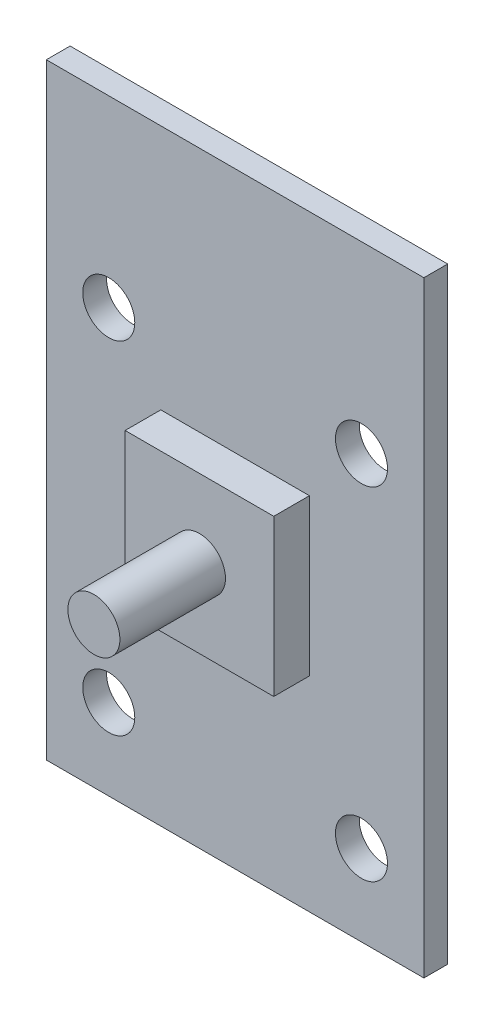
ISO-10303-21;
HEADER;
FILE_DESCRIPTION(('STEP AP214'),'2;1');
FILE_NAME('part.step','',(''),(''),'','','');
FILE_SCHEMA(('AUTOMOTIVE_DESIGN { 1 0 10303 214 1 1 1 1 }'));
ENDSEC;
DATA;
#1=APPLICATION_CONTEXT('core data for automotive mechanical design processes');
#2=APPLICATION_PROTOCOL_DEFINITION('international standard','automotive_design',2000,#1);
#3=PRODUCT_CONTEXT('',#1,'mechanical');
#4=PRODUCT('Part','Part','',(#3));
#5=PRODUCT_RELATED_PRODUCT_CATEGORY('part','',(#4));
#6=PRODUCT_DEFINITION_FORMATION('','',#4);
#7=PRODUCT_DEFINITION_CONTEXT('part definition',#1,'design');
#8=PRODUCT_DEFINITION('design','',#6,#7);
#9=PRODUCT_DEFINITION_SHAPE('','',#8);
#10=(LENGTH_UNIT() NAMED_UNIT(*) SI_UNIT(.MILLI.,.METRE.));
#11=(NAMED_UNIT(*) PLANE_ANGLE_UNIT() SI_UNIT($,.RADIAN.));
#12=(NAMED_UNIT(*) SI_UNIT($,.STERADIAN.) SOLID_ANGLE_UNIT());
#13=UNCERTAINTY_MEASURE_WITH_UNIT(LENGTH_MEASURE(1.E-05),#10,'distance_accuracy_value','');
#14=(GEOMETRIC_REPRESENTATION_CONTEXT(3) GLOBAL_UNCERTAINTY_ASSIGNED_CONTEXT((#13)) GLOBAL_UNIT_ASSIGNED_CONTEXT((#10,
#11,#12)) REPRESENTATION_CONTEXT('',''));
#15=CARTESIAN_POINT('',(0.,0.,0.));
#16=DIRECTION('',(0.,0.,1.));
#17=DIRECTION('',(1.,0.,0.));
#18=AXIS2_PLACEMENT_3D('',#15,#16,#17);
#19=CARTESIAN_POINT('',(0.,0.,1.6));
#20=DIRECTION('',(0.,0.,1.));
#21=DIRECTION('',(1.,0.,0.));
#22=AXIS2_PLACEMENT_3D('',#19,#20,#21);
#23=PLANE('',#22);
#24=CARTESIAN_POINT('',(62.7554487418666,48.4792212091622,1.6));
#25=DIRECTION('',(0.,0.,1.));
#26=DIRECTION('',(1.,0.,0.));
#27=AXIS2_PLACEMENT_3D('',#24,#25,#26);
#28=CIRCLE('',#27,1.75);
#29=CARTESIAN_POINT('',(64.5054487418666,48.4792212091622,1.6));
#30=VERTEX_POINT('',#29);
#31=EDGE_CURVE('E151',#30,#30,#28,.T.);
#32=ORIENTED_EDGE('',*,*,#31,.F.);
#33=EDGE_LOOP('',(#32));
#34=FACE_BOUND('',#33,.T.);
#35=CARTESIAN_POINT('',(62.7554487418666,25.4792212091622,1.6));
#36=DIRECTION('',(0.,0.,1.));
#37=DIRECTION('',(1.,0.,0.));
#38=AXIS2_PLACEMENT_3D('',#35,#36,#37);
#39=CIRCLE('',#38,1.75);
#40=CARTESIAN_POINT('',(64.5054487418666,25.4792212091622,1.6));
#41=VERTEX_POINT('',#40);
#42=EDGE_CURVE('E163',#41,#41,#39,.T.);
#43=ORIENTED_EDGE('',*,*,#42,.F.);
#44=EDGE_LOOP('',(#43));
#45=FACE_BOUND('',#44,.T.);
#46=DIRECTION('',(0.,-1.,0.));
#47=VECTOR('',#46,1.);
#48=CARTESIAN_POINT('',(41.5554487418665,60.8247313490495,1.6));
#49=LINE('',#48,#47);
#50=CARTESIAN_POINT('',(41.5554487418665,60.8247313490495,1.6));
#51=VERTEX_POINT('',#50);
#52=CARTESIAN_POINT('',(41.5554487418665,20.0247313490495,1.6));
#53=VERTEX_POINT('',#52);
#54=EDGE_CURVE('E169',#51,#53,#49,.T.);
#55=ORIENTED_EDGE('',*,*,#54,.T.);
#56=DIRECTION('',(1.,0.,0.));
#57=VECTOR('',#56,1.);
#58=CARTESIAN_POINT('',(41.5554487418665,20.0247313490495,1.6));
#59=LINE('',#58,#57);
#60=CARTESIAN_POINT('',(66.9554487418665,20.0247313490495,1.6));
#61=VERTEX_POINT('',#60);
#62=EDGE_CURVE('E87',#53,#61,#59,.T.);
#63=ORIENTED_EDGE('',*,*,#62,.T.);
#64=DIRECTION('',(0.,1.,0.));
#65=VECTOR('',#64,1.);
#66=CARTESIAN_POINT('',(66.9554487418665,60.8247313490495,1.6));
#67=LINE('',#66,#65);
#68=CARTESIAN_POINT('',(66.9554487418665,60.8247313490495,1.6));
#69=VERTEX_POINT('',#68);
#70=EDGE_CURVE('E172',#61,#69,#67,.T.);
#71=ORIENTED_EDGE('',*,*,#70,.T.);
#72=DIRECTION('',(-1.,0.,0.));
#73=VECTOR('',#72,1.);
#74=CARTESIAN_POINT('',(41.5554487418665,60.8247313490495,1.6));
#75=LINE('',#74,#73);
#76=EDGE_CURVE('E58',#69,#51,#75,.T.);
#77=ORIENTED_EDGE('',*,*,#76,.T.);
#78=EDGE_LOOP('',(#55,#63,#71,#77));
#79=FACE_BOUND('',#78,.T.);
#80=CARTESIAN_POINT('',(45.7554487418666,25.4792212091622,1.6));
#81=DIRECTION('',(0.,0.,1.));
#82=DIRECTION('',(1.,0.,0.));
#83=AXIS2_PLACEMENT_3D('',#80,#81,#82);
#84=CIRCLE('',#83,1.75);
#85=CARTESIAN_POINT('',(47.5054487418666,25.4792212091622,1.6));
#86=VERTEX_POINT('',#85);
#87=EDGE_CURVE('E157',#86,#86,#84,.T.);
#88=ORIENTED_EDGE('',*,*,#87,.F.);
#89=EDGE_LOOP('',(#88));
#90=FACE_BOUND('',#89,.T.);
#91=CARTESIAN_POINT('',(45.7554487418666,48.4792212091622,1.6));
#92=DIRECTION('',(0.,0.,1.));
#93=DIRECTION('',(1.,0.,0.));
#94=AXIS2_PLACEMENT_3D('',#91,#92,#93);
#95=CIRCLE('',#94,1.75);
#96=CARTESIAN_POINT('',(47.5054487418666,48.4792212091622,1.6));
#97=VERTEX_POINT('',#96);
#98=EDGE_CURVE('E145',#97,#97,#95,.T.);
#99=ORIENTED_EDGE('',*,*,#98,.F.);
#100=EDGE_LOOP('',(#99));
#101=FACE_BOUND('',#100,.T.);
#102=DIRECTION('',(-1.,0.,0.));
#103=VECTOR('',#102,1.);
#104=CARTESIAN_POINT('',(49.2554487418665,44.2747313490495,1.6));
#105=LINE('',#104,#103);
#106=CARTESIAN_POINT('',(59.2554487418665,44.2747313490495,1.6));
#107=VERTEX_POINT('',#106);
#108=CARTESIAN_POINT('',(49.2554487418665,44.2747313490495,1.6));
#109=VERTEX_POINT('',#108);
#110=EDGE_CURVE('E210',#107,#109,#105,.T.);
#111=ORIENTED_EDGE('',*,*,#110,.F.);
#112=DIRECTION('',(0.,1.,0.));
#113=VECTOR('',#112,1.);
#114=CARTESIAN_POINT('',(59.2554487418665,44.2747313490495,1.6));
#115=LINE('',#114,#113);
#116=CARTESIAN_POINT('',(59.2554487418665,33.7747313490495,1.6));
#117=VERTEX_POINT('',#116);
#118=EDGE_CURVE('E132',#117,#107,#115,.T.);
#119=ORIENTED_EDGE('',*,*,#118,.F.);
#120=DIRECTION('',(1.,0.,0.));
#121=VECTOR('',#120,1.);
#122=CARTESIAN_POINT('',(49.2554487418665,33.7747313490495,1.6));
#123=LINE('',#122,#121);
#124=CARTESIAN_POINT('',(49.2554487418665,33.7747313490495,1.6));
#125=VERTEX_POINT('',#124);
#126=EDGE_CURVE('E128',#125,#117,#123,.T.);
#127=ORIENTED_EDGE('',*,*,#126,.F.);
#128=DIRECTION('',(0.,-1.,0.));
#129=VECTOR('',#128,1.);
#130=CARTESIAN_POINT('',(49.2554487418665,44.2747313490495,1.6));
#131=LINE('',#130,#129);
#132=EDGE_CURVE('E212',#109,#125,#131,.T.);
#133=ORIENTED_EDGE('',*,*,#132,.F.);
#134=EDGE_LOOP('',(#111,#119,#127,#133));
#135=FACE_BOUND('',#134,.T.);
#136=ADVANCED_FACE('F33',(#34,#45,#79,#90,#101,#135),#23,.T.);
#137=CARTESIAN_POINT('',(0.,0.,0.));
#138=DIRECTION('',(0.,0.,1.));
#139=DIRECTION('',(1.,0.,0.));
#140=AXIS2_PLACEMENT_3D('',#137,#138,#139);
#141=PLANE('',#140);
#142=DIRECTION('',(0.,-1.,0.));
#143=VECTOR('',#142,1.);
#144=CARTESIAN_POINT('',(41.5554487418665,60.8247313490495,0.));
#145=LINE('',#144,#143);
#146=CARTESIAN_POINT('',(41.5554487418665,60.8247313490495,0.));
#147=VERTEX_POINT('',#146);
#148=CARTESIAN_POINT('',(41.5554487418665,20.0247313490495,0.));
#149=VERTEX_POINT('',#148);
#150=EDGE_CURVE('E166',#147,#149,#145,.T.);
#151=ORIENTED_EDGE('',*,*,#150,.F.);
#152=DIRECTION('',(-1.,0.,0.));
#153=VECTOR('',#152,1.);
#154=CARTESIAN_POINT('',(41.5554487418665,60.8247313490495,0.));
#155=LINE('',#154,#153);
#156=CARTESIAN_POINT('',(66.9554487418665,60.8247313490495,0.));
#157=VERTEX_POINT('',#156);
#158=EDGE_CURVE('E79',#157,#147,#155,.T.);
#159=ORIENTED_EDGE('',*,*,#158,.F.);
#160=DIRECTION('',(0.,1.,0.));
#161=VECTOR('',#160,1.);
#162=CARTESIAN_POINT('',(66.9554487418665,60.8247313490495,0.));
#163=LINE('',#162,#161);
#164=CARTESIAN_POINT('',(66.9554487418665,20.0247313490495,0.));
#165=VERTEX_POINT('',#164);
#166=EDGE_CURVE('E180',#165,#157,#163,.T.);
#167=ORIENTED_EDGE('',*,*,#166,.F.);
#168=DIRECTION('',(1.,0.,0.));
#169=VECTOR('',#168,1.);
#170=CARTESIAN_POINT('',(41.5554487418665,20.0247313490495,0.));
#171=LINE('',#170,#169);
#172=EDGE_CURVE('E178',#149,#165,#171,.T.);
#173=ORIENTED_EDGE('',*,*,#172,.F.);
#174=EDGE_LOOP('',(#151,#159,#167,#173));
#175=FACE_BOUND('',#174,.T.);
#176=CARTESIAN_POINT('',(62.7554487418666,25.4792212091622,0.));
#177=DIRECTION('',(0.,0.,1.));
#178=DIRECTION('',(1.,0.,0.));
#179=AXIS2_PLACEMENT_3D('',#176,#177,#178);
#180=CIRCLE('',#179,1.75);
#181=CARTESIAN_POINT('',(64.5054487418666,25.4792212091622,0.));
#182=VERTEX_POINT('',#181);
#183=EDGE_CURVE('E160',#182,#182,#180,.T.);
#184=ORIENTED_EDGE('',*,*,#183,.T.);
#185=EDGE_LOOP('',(#184));
#186=FACE_BOUND('',#185,.T.);
#187=CARTESIAN_POINT('',(45.7554487418666,25.4792212091622,0.));
#188=DIRECTION('',(0.,0.,1.));
#189=DIRECTION('',(1.,0.,0.));
#190=AXIS2_PLACEMENT_3D('',#187,#188,#189);
#191=CIRCLE('',#190,1.75);
#192=CARTESIAN_POINT('',(47.5054487418666,25.4792212091622,0.));
#193=VERTEX_POINT('',#192);
#194=EDGE_CURVE('E154',#193,#193,#191,.T.);
#195=ORIENTED_EDGE('',*,*,#194,.T.);
#196=EDGE_LOOP('',(#195));
#197=FACE_BOUND('',#196,.T.);
#198=CARTESIAN_POINT('',(62.7554487418666,48.4792212091622,0.));
#199=DIRECTION('',(0.,0.,1.));
#200=DIRECTION('',(1.,0.,0.));
#201=AXIS2_PLACEMENT_3D('',#198,#199,#200);
#202=CIRCLE('',#201,1.75);
#203=CARTESIAN_POINT('',(64.5054487418666,48.4792212091622,0.));
#204=VERTEX_POINT('',#203);
#205=EDGE_CURVE('E148',#204,#204,#202,.T.);
#206=ORIENTED_EDGE('',*,*,#205,.T.);
#207=EDGE_LOOP('',(#206));
#208=FACE_BOUND('',#207,.T.);
#209=CARTESIAN_POINT('',(45.7554487418666,48.4792212091622,0.));
#210=DIRECTION('',(0.,0.,1.));
#211=DIRECTION('',(1.,0.,0.));
#212=AXIS2_PLACEMENT_3D('',#209,#210,#211);
#213=CIRCLE('',#212,1.75);
#214=CARTESIAN_POINT('',(47.5054487418666,48.4792212091622,0.));
#215=VERTEX_POINT('',#214);
#216=EDGE_CURVE('E144',#215,#215,#213,.T.);
#217=ORIENTED_EDGE('',*,*,#216,.T.);
#218=EDGE_LOOP('',(#217));
#219=FACE_BOUND('',#218,.T.);
#220=CARTESIAN_POINT('',(54.2554487418665,39.0247313490494,0.));
#221=DIRECTION('',(0.,0.,1.));
#222=DIRECTION('',(1.,0.,0.));
#223=AXIS2_PLACEMENT_3D('',#220,#221,#222);
#224=CIRCLE('',#223,1.81610575474776);
#225=CARTESIAN_POINT('',(56.0715544966143,39.0247313490494,0.));
#226=VERTEX_POINT('',#225);
#227=EDGE_CURVE('E137',#226,#226,#224,.T.);
#228=ORIENTED_EDGE('',*,*,#227,.T.);
#229=EDGE_LOOP('',(#228));
#230=FACE_BOUND('',#229,.T.);
#231=ADVANCED_FACE('F196',(#175,#186,#197,#208,#219,#230),#141,.F.);
#232=CARTESIAN_POINT('',(41.5554487418665,60.8247313490495,1.6));
#233=DIRECTION('',(1.,0.,0.));
#234=DIRECTION('',(0.,1.,0.));
#235=AXIS2_PLACEMENT_3D('',#232,#233,#234);
#236=PLANE('',#235);
#237=ORIENTED_EDGE('',*,*,#150,.T.);
#238=DIRECTION('',(0.,0.,-1.));
#239=VECTOR('',#238,1.);
#240=CARTESIAN_POINT('',(41.5554487418665,20.0247313490495,1.6));
#241=LINE('',#240,#239);
#242=EDGE_CURVE('E37',#53,#149,#241,.T.);
#243=ORIENTED_EDGE('',*,*,#242,.F.);
#244=ORIENTED_EDGE('',*,*,#54,.F.);
#245=DIRECTION('',(0.,0.,-1.));
#246=VECTOR('',#245,1.);
#247=CARTESIAN_POINT('',(41.5554487418665,60.8247313490495,1.6));
#248=LINE('',#247,#246);
#249=EDGE_CURVE('E175',#51,#147,#248,.T.);
#250=ORIENTED_EDGE('',*,*,#249,.T.);
#251=EDGE_LOOP('',(#237,#243,#244,#250));
#252=FACE_BOUND('',#251,.T.);
#253=ADVANCED_FACE('F35',(#252),#236,.F.);
#254=CARTESIAN_POINT('',(41.5554487418665,20.0247313490495,1.6));
#255=DIRECTION('',(0.,1.,0.));
#256=DIRECTION('',(0.,0.,1.));
#257=AXIS2_PLACEMENT_3D('',#254,#255,#256);
#258=PLANE('',#257);
#259=ORIENTED_EDGE('',*,*,#172,.T.);
#260=DIRECTION('',(0.,0.,-1.));
#261=VECTOR('',#260,1.);
#262=CARTESIAN_POINT('',(66.9554487418665,20.0247313490495,1.6));
#263=LINE('',#262,#261);
#264=EDGE_CURVE('E185',#61,#165,#263,.T.);
#265=ORIENTED_EDGE('',*,*,#264,.F.);
#266=ORIENTED_EDGE('',*,*,#62,.F.);
#267=ORIENTED_EDGE('',*,*,#242,.T.);
#268=EDGE_LOOP('',(#259,#265,#266,#267));
#269=FACE_BOUND('',#268,.T.);
#270=ADVANCED_FACE('F191',(#269),#258,.F.);
#271=CARTESIAN_POINT('',(66.9554487418665,60.8247313490495,1.6));
#272=DIRECTION('',(-1.,0.,0.));
#273=DIRECTION('',(0.,-1.,0.));
#274=AXIS2_PLACEMENT_3D('',#271,#272,#273);
#275=PLANE('',#274);
#276=ORIENTED_EDGE('',*,*,#166,.T.);
#277=DIRECTION('',(0.,0.,-1.));
#278=VECTOR('',#277,1.);
#279=CARTESIAN_POINT('',(66.9554487418665,60.8247313490495,1.6));
#280=LINE('',#279,#278);
#281=EDGE_CURVE('E184',#69,#157,#280,.T.);
#282=ORIENTED_EDGE('',*,*,#281,.F.);
#283=ORIENTED_EDGE('',*,*,#70,.F.);
#284=ORIENTED_EDGE('',*,*,#264,.T.);
#285=EDGE_LOOP('',(#276,#282,#283,#284));
#286=FACE_BOUND('',#285,.T.);
#287=ADVANCED_FACE('F199',(#286),#275,.F.);
#288=CARTESIAN_POINT('',(41.5554487418665,60.8247313490495,1.6));
#289=DIRECTION('',(0.,-1.,0.));
#290=DIRECTION('',(0.,0.,-1.));
#291=AXIS2_PLACEMENT_3D('',#288,#289,#290);
#292=PLANE('',#291);
#293=ORIENTED_EDGE('',*,*,#158,.T.);
#294=ORIENTED_EDGE('',*,*,#249,.F.);
#295=ORIENTED_EDGE('',*,*,#76,.F.);
#296=ORIENTED_EDGE('',*,*,#281,.T.);
#297=EDGE_LOOP('',(#293,#294,#295,#296));
#298=FACE_BOUND('',#297,.T.);
#299=ADVANCED_FACE('F200',(#298),#292,.F.);
#300=CARTESIAN_POINT('',(62.7554487418666,25.4792212091622,1.6));
#301=DIRECTION('',(0.,0.,-1.));
#302=DIRECTION('',(-1.,0.,0.));
#303=AXIS2_PLACEMENT_3D('',#300,#301,#302);
#304=CYLINDRICAL_SURFACE('',#303,1.75);
#305=ORIENTED_EDGE('',*,*,#42,.T.);
#306=EDGE_LOOP('',(#305));
#307=FACE_BOUND('',#306,.T.);
#308=ORIENTED_EDGE('',*,*,#183,.F.);
#309=EDGE_LOOP('',(#308));
#310=FACE_BOUND('',#309,.T.);
#311=ADVANCED_FACE('F270',(#307,#310),#304,.F.);
#312=CARTESIAN_POINT('',(45.7554487418666,25.4792212091622,1.6));
#313=DIRECTION('',(0.,0.,-1.));
#314=DIRECTION('',(-1.,0.,0.));
#315=AXIS2_PLACEMENT_3D('',#312,#313,#314);
#316=CYLINDRICAL_SURFACE('',#315,1.75);
#317=ORIENTED_EDGE('',*,*,#87,.T.);
#318=EDGE_LOOP('',(#317));
#319=FACE_BOUND('',#318,.T.);
#320=ORIENTED_EDGE('',*,*,#194,.F.);
#321=EDGE_LOOP('',(#320));
#322=FACE_BOUND('',#321,.T.);
#323=ADVANCED_FACE('F266',(#319,#322),#316,.F.);
#324=CARTESIAN_POINT('',(62.7554487418666,48.4792212091622,1.6));
#325=DIRECTION('',(0.,0.,-1.));
#326=DIRECTION('',(-1.,0.,0.));
#327=AXIS2_PLACEMENT_3D('',#324,#325,#326);
#328=CYLINDRICAL_SURFACE('',#327,1.75);
#329=ORIENTED_EDGE('',*,*,#31,.T.);
#330=EDGE_LOOP('',(#329));
#331=FACE_BOUND('',#330,.T.);
#332=ORIENTED_EDGE('',*,*,#205,.F.);
#333=EDGE_LOOP('',(#332));
#334=FACE_BOUND('',#333,.T.);
#335=ADVANCED_FACE('F262',(#331,#334),#328,.F.);
#336=CARTESIAN_POINT('',(45.7554487418666,48.4792212091622,1.6));
#337=DIRECTION('',(0.,0.,-1.));
#338=DIRECTION('',(-1.,0.,0.));
#339=AXIS2_PLACEMENT_3D('',#336,#337,#338);
#340=CYLINDRICAL_SURFACE('',#339,1.75);
#341=ORIENTED_EDGE('',*,*,#98,.T.);
#342=EDGE_LOOP('',(#341));
#343=FACE_BOUND('',#342,.T.);
#344=ORIENTED_EDGE('',*,*,#216,.F.);
#345=EDGE_LOOP('',(#344));
#346=FACE_BOUND('',#345,.T.);
#347=ADVANCED_FACE('F258',(#343,#346),#340,.F.);
#348=CARTESIAN_POINT('',(54.2554487418665,39.0247313490494,1.6));
#349=DIRECTION('',(0.,0.,-1.));
#350=DIRECTION('',(-1.,0.,0.));
#351=AXIS2_PLACEMENT_3D('',#348,#349,#350);
#352=CYLINDRICAL_SURFACE('',#351,1.81610575474776);
#353=CARTESIAN_POINT('',(54.2554487418665,39.0247313490494,1.6));
#354=DIRECTION('',(0.,0.,1.));
#355=DIRECTION('',(1.,0.,0.));
#356=AXIS2_PLACEMENT_3D('',#353,#354,#355);
#357=CIRCLE('',#356,1.81610575474776);
#358=CARTESIAN_POINT('',(56.0715544966143,39.0247313490494,1.6));
#359=VERTEX_POINT('',#358);
#360=EDGE_CURVE('E134',#359,#359,#357,.T.);
#361=ORIENTED_EDGE('',*,*,#360,.T.);
#362=EDGE_LOOP('',(#361));
#363=FACE_BOUND('',#362,.T.);
#364=ORIENTED_EDGE('',*,*,#227,.F.);
#365=EDGE_LOOP('',(#364));
#366=FACE_BOUND('',#365,.T.);
#367=ADVANCED_FACE('F246',(#363,#366),#352,.F.);
#368=CARTESIAN_POINT('',(0.,0.,1.6));
#369=DIRECTION('',(0.,0.,1.));
#370=DIRECTION('',(1.,0.,0.));
#371=AXIS2_PLACEMENT_3D('',#368,#369,#370);
#372=PLANE('',#371);
#373=ORIENTED_EDGE('',*,*,#360,.F.);
#374=EDGE_LOOP('',(#373));
#375=FACE_BOUND('',#374,.T.);
#376=ADVANCED_FACE('F244',(#375),#372,.F.);
#377=CARTESIAN_POINT('',(59.2554487418665,44.2747313490495,4.));
#378=DIRECTION('',(-1.,0.,0.));
#379=DIRECTION('',(0.,0.,1.));
#380=AXIS2_PLACEMENT_3D('',#377,#378,#379);
#381=PLANE('',#380);
#382=ORIENTED_EDGE('',*,*,#118,.T.);
#383=DIRECTION('',(0.,0.,-1.));
#384=VECTOR('',#383,1.);
#385=CARTESIAN_POINT('',(59.2554487418665,44.2747313490495,4.));
#386=LINE('',#385,#384);
#387=CARTESIAN_POINT('',(59.2554487418665,44.2747313490495,4.));
#388=VERTEX_POINT('',#387);
#389=EDGE_CURVE('E113',#388,#107,#386,.T.);
#390=ORIENTED_EDGE('',*,*,#389,.F.);
#391=DIRECTION('',(0.,1.,0.));
#392=VECTOR('',#391,1.);
#393=CARTESIAN_POINT('',(59.2554487418665,44.2747313490495,4.));
#394=LINE('',#393,#392);
#395=CARTESIAN_POINT('',(59.2554487418665,33.7747313490495,4.));
#396=VERTEX_POINT('',#395);
#397=EDGE_CURVE('E120',#396,#388,#394,.T.);
#398=ORIENTED_EDGE('',*,*,#397,.F.);
#399=DIRECTION('',(0.,0.,-1.));
#400=VECTOR('',#399,1.);
#401=CARTESIAN_POINT('',(59.2554487418665,33.7747313490495,4.));
#402=LINE('',#401,#400);
#403=EDGE_CURVE('E220',#396,#117,#402,.T.);
#404=ORIENTED_EDGE('',*,*,#403,.T.);
#405=EDGE_LOOP('',(#382,#390,#398,#404));
#406=FACE_BOUND('',#405,.T.);
#407=ADVANCED_FACE('F130',(#406),#381,.F.);
#408=CARTESIAN_POINT('',(49.2554487418665,44.2747313490495,4.));
#409=DIRECTION('',(0.,-1.,0.));
#410=DIRECTION('',(0.,0.,-1.));
#411=AXIS2_PLACEMENT_3D('',#408,#409,#410);
#412=PLANE('',#411);
#413=ORIENTED_EDGE('',*,*,#110,.T.);
#414=DIRECTION('',(0.,0.,-1.));
#415=VECTOR('',#414,1.);
#416=CARTESIAN_POINT('',(49.2554487418665,44.2747313490495,4.));
#417=LINE('',#416,#415);
#418=CARTESIAN_POINT('',(49.2554487418665,44.2747313490495,4.));
#419=VERTEX_POINT('',#418);
#420=EDGE_CURVE('E116',#419,#109,#417,.T.);
#421=ORIENTED_EDGE('',*,*,#420,.F.);
#422=DIRECTION('',(-1.,0.,0.));
#423=VECTOR('',#422,1.);
#424=CARTESIAN_POINT('',(49.2554487418665,44.2747313490495,4.));
#425=LINE('',#424,#423);
#426=EDGE_CURVE('E109',#388,#419,#425,.T.);
#427=ORIENTED_EDGE('',*,*,#426,.F.);
#428=ORIENTED_EDGE('',*,*,#389,.T.);
#429=EDGE_LOOP('',(#413,#421,#427,#428));
#430=FACE_BOUND('',#429,.T.);
#431=ADVANCED_FACE('F111',(#430),#412,.F.);
#432=CARTESIAN_POINT('',(49.2554487418665,44.2747313490495,4.));
#433=DIRECTION('',(1.,0.,0.));
#434=DIRECTION('',(0.,0.,-1.));
#435=AXIS2_PLACEMENT_3D('',#432,#433,#434);
#436=PLANE('',#435);
#437=ORIENTED_EDGE('',*,*,#132,.T.);
#438=DIRECTION('',(0.,0.,-1.));
#439=VECTOR('',#438,1.);
#440=CARTESIAN_POINT('',(49.2554487418665,33.7747313490495,4.));
#441=LINE('',#440,#439);
#442=CARTESIAN_POINT('',(49.2554487418665,33.7747313490495,4.));
#443=VERTEX_POINT('',#442);
#444=EDGE_CURVE('E49',#443,#125,#441,.T.);
#445=ORIENTED_EDGE('',*,*,#444,.F.);
#446=DIRECTION('',(0.,-1.,0.));
#447=VECTOR('',#446,1.);
#448=CARTESIAN_POINT('',(49.2554487418665,44.2747313490495,4.));
#449=LINE('',#448,#447);
#450=EDGE_CURVE('E119',#419,#443,#449,.T.);
#451=ORIENTED_EDGE('',*,*,#450,.F.);
#452=ORIENTED_EDGE('',*,*,#420,.T.);
#453=EDGE_LOOP('',(#437,#445,#451,#452));
#454=FACE_BOUND('',#453,.T.);
#455=ADVANCED_FACE('F240',(#454),#436,.F.);
#456=CARTESIAN_POINT('',(49.2554487418665,33.7747313490495,4.));
#457=DIRECTION('',(0.,1.,0.));
#458=DIRECTION('',(0.,0.,1.));
#459=AXIS2_PLACEMENT_3D('',#456,#457,#458);
#460=PLANE('',#459);
#461=ORIENTED_EDGE('',*,*,#126,.T.);
#462=ORIENTED_EDGE('',*,*,#403,.F.);
#463=DIRECTION('',(1.,0.,0.));
#464=VECTOR('',#463,1.);
#465=CARTESIAN_POINT('',(49.2554487418665,33.7747313490495,4.));
#466=LINE('',#465,#464);
#467=EDGE_CURVE('E124',#443,#396,#466,.T.);
#468=ORIENTED_EDGE('',*,*,#467,.F.);
#469=ORIENTED_EDGE('',*,*,#444,.T.);
#470=EDGE_LOOP('',(#461,#462,#468,#469));
#471=FACE_BOUND('',#470,.T.);
#472=ADVANCED_FACE('F235',(#471),#460,.F.);
#473=CARTESIAN_POINT('',(0.,0.,4.));
#474=DIRECTION('',(0.,0.,1.));
#475=DIRECTION('',(1.,0.,0.));
#476=AXIS2_PLACEMENT_3D('',#473,#474,#475);
#477=PLANE('',#476);
#478=CARTESIAN_POINT('',(54.2554487418665,39.0247313490495,4.));
#479=DIRECTION('',(0.,0.,1.));
#480=DIRECTION('',(1.,0.,0.));
#481=AXIS2_PLACEMENT_3D('',#478,#479,#480);
#482=CIRCLE('',#481,1.75);
#483=CARTESIAN_POINT('',(56.0054487418665,39.0247313490495,4.));
#484=VERTEX_POINT('',#483);
#485=EDGE_CURVE('E11',#484,#484,#482,.T.);
#486=ORIENTED_EDGE('',*,*,#485,.F.);
#487=EDGE_LOOP('',(#486));
#488=FACE_BOUND('',#487,.T.);
#489=ORIENTED_EDGE('',*,*,#397,.T.);
#490=ORIENTED_EDGE('',*,*,#426,.T.);
#491=ORIENTED_EDGE('',*,*,#450,.T.);
#492=ORIENTED_EDGE('',*,*,#467,.T.);
#493=EDGE_LOOP('',(#489,#490,#491,#492));
#494=FACE_BOUND('',#493,.T.);
#495=ADVANCED_FACE('F123',(#488,#494),#477,.T.);
#496=CARTESIAN_POINT('',(54.2554487418665,39.0247313490495,11.1));
#497=DIRECTION('',(0.,0.,-1.));
#498=DIRECTION('',(-1.,0.,0.));
#499=AXIS2_PLACEMENT_3D('',#496,#497,#498);
#500=CYLINDRICAL_SURFACE('',#499,1.75);
#501=CARTESIAN_POINT('',(54.2554487418665,39.0247313490495,11.1));
#502=DIRECTION('',(0.,0.,1.));
#503=DIRECTION('',(1.,0.,0.));
#504=AXIS2_PLACEMENT_3D('',#501,#502,#503);
#505=CIRCLE('',#504,1.75);
#506=CARTESIAN_POINT('',(56.0054487418665,39.0247313490495,11.1));
#507=VERTEX_POINT('',#506);
#508=EDGE_CURVE('E215',#507,#507,#505,.T.);
#509=ORIENTED_EDGE('',*,*,#508,.F.);
#510=EDGE_LOOP('',(#509));
#511=FACE_BOUND('',#510,.T.);
#512=ORIENTED_EDGE('',*,*,#485,.T.);
#513=EDGE_LOOP('',(#512));
#514=FACE_BOUND('',#513,.T.);
#515=ADVANCED_FACE('F228',(#511,#514),#500,.T.);
#516=CARTESIAN_POINT('',(54.2554487418665,39.0247313490495,11.1));
#517=DIRECTION('',(0.,0.,1.));
#518=DIRECTION('',(1.,0.,0.));
#519=AXIS2_PLACEMENT_3D('',#516,#517,#518);
#520=PLANE('',#519);
#521=ORIENTED_EDGE('',*,*,#508,.T.);
#522=EDGE_LOOP('',(#521));
#523=FACE_BOUND('',#522,.T.);
#524=ADVANCED_FACE('F226',(#523),#520,.T.);
#525=CLOSED_SHELL('',(#136,#231,#253,#270,#287,#299,#311,#323,#335,#347,#367,#376,#407,#431,
#455,#472,#495,#515,#524));
#526=MANIFOLD_SOLID_BREP('B2',#525);
#527=ADVANCED_BREP_SHAPE_REPRESENTATION('',(#18,#526),#14);
#528=SHAPE_DEFINITION_REPRESENTATION(#9,#527);
ENDSEC;
END-ISO-10303-21;
